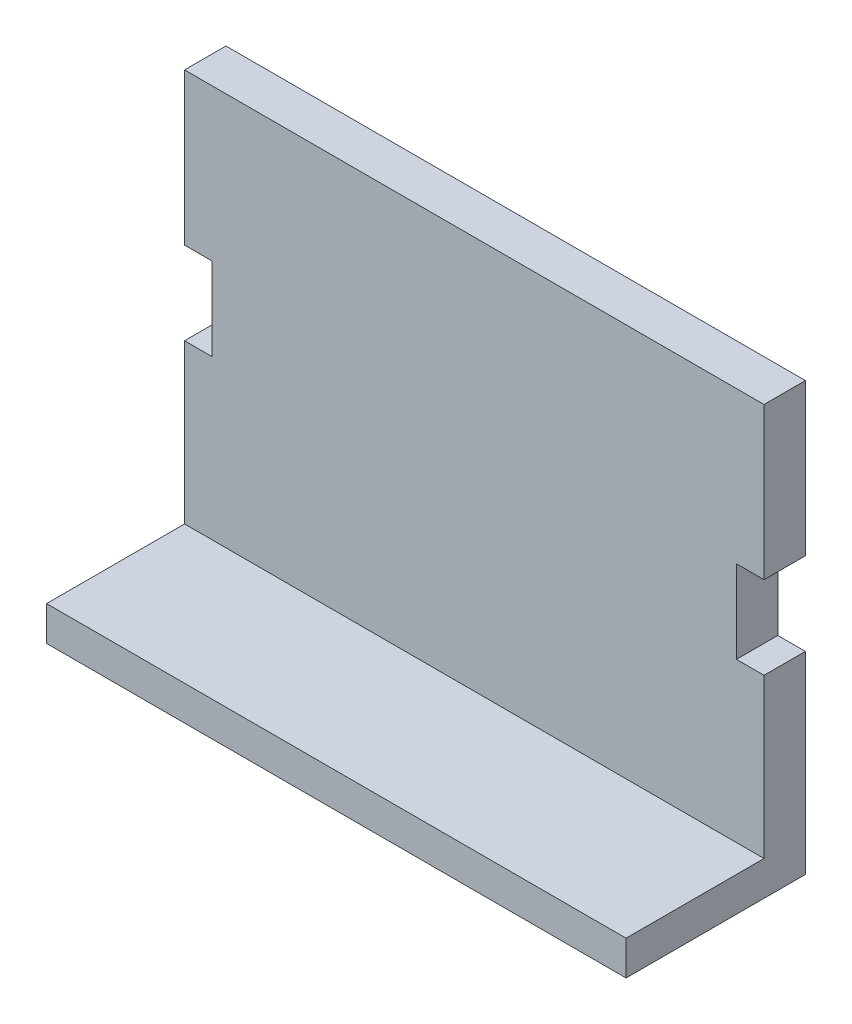
ISO-10303-21;
HEADER;
FILE_DESCRIPTION(('STEP AP214'),'2;1');
FILE_NAME('part.step','',(''),(''),'','','');
FILE_SCHEMA(('AUTOMOTIVE_DESIGN { 1 0 10303 214 1 1 1 1 }'));
ENDSEC;
DATA;
#1=APPLICATION_CONTEXT('core data for automotive mechanical design processes');
#2=APPLICATION_PROTOCOL_DEFINITION('international standard','automotive_design',2000,#1);
#3=PRODUCT_CONTEXT('',#1,'mechanical');
#4=PRODUCT('Part','Part','',(#3));
#5=PRODUCT_RELATED_PRODUCT_CATEGORY('part','',(#4));
#6=PRODUCT_DEFINITION_FORMATION('','',#4);
#7=PRODUCT_DEFINITION_CONTEXT('part definition',#1,'design');
#8=PRODUCT_DEFINITION('design','',#6,#7);
#9=PRODUCT_DEFINITION_SHAPE('','',#8);
#10=(LENGTH_UNIT() NAMED_UNIT(*) SI_UNIT(.MILLI.,.METRE.));
#11=(NAMED_UNIT(*) PLANE_ANGLE_UNIT() SI_UNIT($,.RADIAN.));
#12=(NAMED_UNIT(*) SI_UNIT($,.STERADIAN.) SOLID_ANGLE_UNIT());
#13=UNCERTAINTY_MEASURE_WITH_UNIT(LENGTH_MEASURE(1.E-05),#10,'distance_accuracy_value','');
#14=(GEOMETRIC_REPRESENTATION_CONTEXT(3) GLOBAL_UNCERTAINTY_ASSIGNED_CONTEXT((#13)) GLOBAL_UNIT_ASSIGNED_CONTEXT((#10,
#11,#12)) REPRESENTATION_CONTEXT('',''));
#15=CARTESIAN_POINT('',(0.,0.,0.));
#16=DIRECTION('',(0.,0.,1.));
#17=DIRECTION('',(1.,0.,0.));
#18=AXIS2_PLACEMENT_3D('',#15,#16,#17);
#19=CARTESIAN_POINT('',(0.,0.,6.));
#20=DIRECTION('',(0.,0.,-1.));
#21=DIRECTION('',(-1.,0.,0.));
#22=AXIS2_PLACEMENT_3D('',#19,#20,#21);
#23=PLANE('',#22);
#24=DIRECTION('',(-1.,0.,0.));
#25=VECTOR('',#24,1.);
#26=CARTESIAN_POINT('',(0.,5.,6.));
#27=LINE('',#26,#25);
#28=CARTESIAN_POINT('',(84.,5.,6.));
#29=VERTEX_POINT('',#28);
#30=CARTESIAN_POINT('',(0.,5.,6.));
#31=VERTEX_POINT('',#30);
#32=EDGE_CURVE('E59',#29,#31,#27,.T.);
#33=ORIENTED_EDGE('',*,*,#32,.F.);
#34=DIRECTION('',(0.,1.,0.));
#35=VECTOR('',#34,1.);
#36=CARTESIAN_POINT('',(84.,0.,6.));
#37=LINE('',#36,#35);
#38=CARTESIAN_POINT('',(84.,28.,6.));
#39=VERTEX_POINT('',#38);
#40=EDGE_CURVE('E116',#29,#39,#37,.T.);
#41=ORIENTED_EDGE('',*,*,#40,.T.);
#42=DIRECTION('',(-1.,0.,0.));
#43=VECTOR('',#42,1.);
#44=CARTESIAN_POINT('',(84.,28.,6.));
#45=LINE('',#44,#43);
#46=CARTESIAN_POINT('',(80.,28.,6.));
#47=VERTEX_POINT('',#46);
#48=EDGE_CURVE('E268',#39,#47,#45,.T.);
#49=ORIENTED_EDGE('',*,*,#48,.T.);
#50=DIRECTION('',(0.,1.,0.));
#51=VECTOR('',#50,1.);
#52=CARTESIAN_POINT('',(80.,28.,6.));
#53=LINE('',#52,#51);
#54=CARTESIAN_POINT('',(80.,40.,6.));
#55=VERTEX_POINT('',#54);
#56=EDGE_CURVE('E264',#47,#55,#53,.T.);
#57=ORIENTED_EDGE('',*,*,#56,.T.);
#58=DIRECTION('',(1.,0.,0.));
#59=VECTOR('',#58,1.);
#60=CARTESIAN_POINT('',(80.,40.,6.));
#61=LINE('',#60,#59);
#62=CARTESIAN_POINT('',(84.,40.,6.));
#63=VERTEX_POINT('',#62);
#64=EDGE_CURVE('E267',#55,#63,#61,.T.);
#65=ORIENTED_EDGE('',*,*,#64,.T.);
#66=DIRECTION('',(0.,1.,0.));
#67=VECTOR('',#66,1.);
#68=CARTESIAN_POINT('',(84.,62.,6.));
#69=LINE('',#68,#67);
#70=CARTESIAN_POINT('',(84.,62.,6.));
#71=VERTEX_POINT('',#70);
#72=EDGE_CURVE('E272',#63,#71,#69,.T.);
#73=ORIENTED_EDGE('',*,*,#72,.T.);
#74=DIRECTION('',(-1.,0.,0.));
#75=VECTOR('',#74,1.);
#76=CARTESIAN_POINT('',(0.,62.,6.));
#77=LINE('',#76,#75);
#78=CARTESIAN_POINT('',(0.,62.,6.));
#79=VERTEX_POINT('',#78);
#80=EDGE_CURVE('E279',#71,#79,#77,.T.);
#81=ORIENTED_EDGE('',*,*,#80,.T.);
#82=DIRECTION('',(0.,-1.,0.));
#83=VECTOR('',#82,1.);
#84=CARTESIAN_POINT('',(0.,40.,6.));
#85=LINE('',#84,#83);
#86=CARTESIAN_POINT('',(0.,40.,6.));
#87=VERTEX_POINT('',#86);
#88=EDGE_CURVE('E145',#79,#87,#85,.T.);
#89=ORIENTED_EDGE('',*,*,#88,.T.);
#90=DIRECTION('',(1.,0.,0.));
#91=VECTOR('',#90,1.);
#92=CARTESIAN_POINT('',(4.,40.,6.));
#93=LINE('',#92,#91);
#94=CARTESIAN_POINT('',(4.,40.,6.));
#95=VERTEX_POINT('',#94);
#96=EDGE_CURVE('E139',#87,#95,#93,.T.);
#97=ORIENTED_EDGE('',*,*,#96,.T.);
#98=DIRECTION('',(0.,-1.,0.));
#99=VECTOR('',#98,1.);
#100=CARTESIAN_POINT('',(4.,28.,6.));
#101=LINE('',#100,#99);
#102=CARTESIAN_POINT('',(4.,28.,6.));
#103=VERTEX_POINT('',#102);
#104=EDGE_CURVE('E142',#95,#103,#101,.T.);
#105=ORIENTED_EDGE('',*,*,#104,.T.);
#106=DIRECTION('',(-1.,0.,0.));
#107=VECTOR('',#106,1.);
#108=CARTESIAN_POINT('',(0.,28.,6.));
#109=LINE('',#108,#107);
#110=CARTESIAN_POINT('',(0.,28.,6.));
#111=VERTEX_POINT('',#110);
#112=EDGE_CURVE('E66',#103,#111,#109,.T.);
#113=ORIENTED_EDGE('',*,*,#112,.T.);
#114=DIRECTION('',(0.,-1.,0.));
#115=VECTOR('',#114,1.);
#116=CARTESIAN_POINT('',(0.,0.,6.));
#117=LINE('',#116,#115);
#118=EDGE_CURVE('E206',#111,#31,#117,.T.);
#119=ORIENTED_EDGE('',*,*,#118,.T.);
#120=EDGE_LOOP('',(#33,#41,#49,#57,#65,#73,#81,#89,#97,#105,#113,#119));
#121=FACE_BOUND('',#120,.T.);
#122=ADVANCED_FACE('F43',(#121),#23,.F.);
#123=CARTESIAN_POINT('',(0.,0.,6.));
#124=DIRECTION('',(1.,0.,0.));
#125=DIRECTION('',(0.,0.,-1.));
#126=AXIS2_PLACEMENT_3D('',#123,#124,#125);
#127=PLANE('',#126);
#128=DIRECTION('',(0.,-1.,0.));
#129=VECTOR('',#128,1.);
#130=CARTESIAN_POINT('',(0.,0.,0.));
#131=LINE('',#130,#129);
#132=CARTESIAN_POINT('',(0.,28.,0.));
#133=VERTEX_POINT('',#132);
#134=CARTESIAN_POINT('',(0.,0.,0.));
#135=VERTEX_POINT('',#134);
#136=EDGE_CURVE('E170',#133,#135,#131,.T.);
#137=ORIENTED_EDGE('',*,*,#136,.T.);
#138=DIRECTION('',(0.,0.,-1.));
#139=VECTOR('',#138,1.);
#140=CARTESIAN_POINT('',(0.,0.,6.));
#141=LINE('',#140,#139);
#142=CARTESIAN_POINT('',(0.,0.,26.));
#143=VERTEX_POINT('',#142);
#144=EDGE_CURVE('E11',#143,#135,#141,.T.);
#145=ORIENTED_EDGE('',*,*,#144,.F.);
#146=DIRECTION('',(0.,-1.,0.));
#147=VECTOR('',#146,1.);
#148=CARTESIAN_POINT('',(0.,0.,26.));
#149=LINE('',#148,#147);
#150=CARTESIAN_POINT('',(0.,5.,26.));
#151=VERTEX_POINT('',#150);
#152=EDGE_CURVE('E308',#151,#143,#149,.T.);
#153=ORIENTED_EDGE('',*,*,#152,.F.);
#154=DIRECTION('',(0.,0.,-1.));
#155=VECTOR('',#154,1.);
#156=CARTESIAN_POINT('',(0.,5.,26.));
#157=LINE('',#156,#155);
#158=EDGE_CURVE('E298',#151,#31,#157,.T.);
#159=ORIENTED_EDGE('',*,*,#158,.T.);
#160=ORIENTED_EDGE('',*,*,#118,.F.);
#161=DIRECTION('',(0.,0.,-1.));
#162=VECTOR('',#161,1.);
#163=CARTESIAN_POINT('',(0.,28.,6.));
#164=LINE('',#163,#162);
#165=EDGE_CURVE('E166',#111,#133,#164,.T.);
#166=ORIENTED_EDGE('',*,*,#165,.T.);
#167=EDGE_LOOP('',(#137,#145,#153,#159,#160,#166));
#168=FACE_BOUND('',#167,.T.);
#169=ADVANCED_FACE('F45',(#168),#127,.F.);
#170=CARTESIAN_POINT('',(0.,0.,6.));
#171=DIRECTION('',(0.,1.,0.));
#172=DIRECTION('',(0.,0.,1.));
#173=AXIS2_PLACEMENT_3D('',#170,#171,#172);
#174=PLANE('',#173);
#175=DIRECTION('',(1.,0.,0.));
#176=VECTOR('',#175,1.);
#177=CARTESIAN_POINT('',(0.,0.,0.));
#178=LINE('',#177,#176);
#179=CARTESIAN_POINT('',(84.,0.,0.));
#180=VERTEX_POINT('',#179);
#181=EDGE_CURVE('E174',#135,#180,#178,.T.);
#182=ORIENTED_EDGE('',*,*,#181,.T.);
#183=DIRECTION('',(0.,0.,-1.));
#184=VECTOR('',#183,1.);
#185=CARTESIAN_POINT('',(84.,0.,6.));
#186=LINE('',#185,#184);
#187=CARTESIAN_POINT('',(84.,0.,26.));
#188=VERTEX_POINT('',#187);
#189=EDGE_CURVE('E52',#188,#180,#186,.T.);
#190=ORIENTED_EDGE('',*,*,#189,.F.);
#191=DIRECTION('',(1.,0.,0.));
#192=VECTOR('',#191,1.);
#193=CARTESIAN_POINT('',(84.,0.,26.));
#194=LINE('',#193,#192);
#195=EDGE_CURVE('E311',#143,#188,#194,.T.);
#196=ORIENTED_EDGE('',*,*,#195,.F.);
#197=ORIENTED_EDGE('',*,*,#144,.T.);
#198=EDGE_LOOP('',(#182,#190,#196,#197));
#199=FACE_BOUND('',#198,.T.);
#200=ADVANCED_FACE('F326',(#199),#174,.F.);
#201=CARTESIAN_POINT('',(84.,0.,6.));
#202=DIRECTION('',(-1.,0.,0.));
#203=DIRECTION('',(0.,0.,1.));
#204=AXIS2_PLACEMENT_3D('',#201,#202,#203);
#205=PLANE('',#204);
#206=DIRECTION('',(0.,1.,0.));
#207=VECTOR('',#206,1.);
#208=CARTESIAN_POINT('',(84.,0.,0.));
#209=LINE('',#208,#207);
#210=CARTESIAN_POINT('',(84.,28.,0.));
#211=VERTEX_POINT('',#210);
#212=EDGE_CURVE('E178',#180,#211,#209,.T.);
#213=ORIENTED_EDGE('',*,*,#212,.T.);
#214=DIRECTION('',(0.,0.,-1.));
#215=VECTOR('',#214,1.);
#216=CARTESIAN_POINT('',(84.,28.,6.));
#217=LINE('',#216,#215);
#218=EDGE_CURVE('E233',#39,#211,#217,.T.);
#219=ORIENTED_EDGE('',*,*,#218,.F.);
#220=ORIENTED_EDGE('',*,*,#40,.F.);
#221=DIRECTION('',(0.,0.,-1.));
#222=VECTOR('',#221,1.);
#223=CARTESIAN_POINT('',(84.,5.,26.));
#224=LINE('',#223,#222);
#225=CARTESIAN_POINT('',(84.,5.,26.));
#226=VERTEX_POINT('',#225);
#227=EDGE_CURVE('E175',#226,#29,#224,.T.);
#228=ORIENTED_EDGE('',*,*,#227,.F.);
#229=DIRECTION('',(0.,1.,0.));
#230=VECTOR('',#229,1.);
#231=CARTESIAN_POINT('',(84.,5.,26.));
#232=LINE('',#231,#230);
#233=EDGE_CURVE('E246',#188,#226,#232,.T.);
#234=ORIENTED_EDGE('',*,*,#233,.F.);
#235=ORIENTED_EDGE('',*,*,#189,.T.);
#236=EDGE_LOOP('',(#213,#219,#220,#228,#234,#235));
#237=FACE_BOUND('',#236,.T.);
#238=ADVANCED_FACE('F242',(#237),#205,.F.);
#239=CARTESIAN_POINT('',(84.,28.,6.));
#240=DIRECTION('',(0.,-1.,0.));
#241=DIRECTION('',(0.,0.,-1.));
#242=AXIS2_PLACEMENT_3D('',#239,#240,#241);
#243=PLANE('',#242);
#244=DIRECTION('',(-1.,0.,0.));
#245=VECTOR('',#244,1.);
#246=CARTESIAN_POINT('',(84.,28.,0.));
#247=LINE('',#246,#245);
#248=CARTESIAN_POINT('',(80.,28.,0.));
#249=VERTEX_POINT('',#248);
#250=EDGE_CURVE('E181',#211,#249,#247,.T.);
#251=ORIENTED_EDGE('',*,*,#250,.T.);
#252=DIRECTION('',(0.,0.,-1.));
#253=VECTOR('',#252,1.);
#254=CARTESIAN_POINT('',(80.,28.,6.));
#255=LINE('',#254,#253);
#256=EDGE_CURVE('E229',#47,#249,#255,.T.);
#257=ORIENTED_EDGE('',*,*,#256,.F.);
#258=ORIENTED_EDGE('',*,*,#48,.F.);
#259=ORIENTED_EDGE('',*,*,#218,.T.);
#260=EDGE_LOOP('',(#251,#257,#258,#259));
#261=FACE_BOUND('',#260,.T.);
#262=ADVANCED_FACE('F258',(#261),#243,.F.);
#263=CARTESIAN_POINT('',(80.,28.,6.));
#264=DIRECTION('',(-1.,0.,0.));
#265=DIRECTION('',(0.,0.,1.));
#266=AXIS2_PLACEMENT_3D('',#263,#264,#265);
#267=PLANE('',#266);
#268=DIRECTION('',(0.,1.,0.));
#269=VECTOR('',#268,1.);
#270=CARTESIAN_POINT('',(80.,28.,0.));
#271=LINE('',#270,#269);
#272=CARTESIAN_POINT('',(80.,40.,0.));
#273=VERTEX_POINT('',#272);
#274=EDGE_CURVE('E184',#249,#273,#271,.T.);
#275=ORIENTED_EDGE('',*,*,#274,.T.);
#276=DIRECTION('',(0.,0.,-1.));
#277=VECTOR('',#276,1.);
#278=CARTESIAN_POINT('',(80.,40.,6.));
#279=LINE('',#278,#277);
#280=EDGE_CURVE('E225',#55,#273,#279,.T.);
#281=ORIENTED_EDGE('',*,*,#280,.F.);
#282=ORIENTED_EDGE('',*,*,#56,.F.);
#283=ORIENTED_EDGE('',*,*,#256,.T.);
#284=EDGE_LOOP('',(#275,#281,#282,#283));
#285=FACE_BOUND('',#284,.T.);
#286=ADVANCED_FACE('F262',(#285),#267,.F.);
#287=CARTESIAN_POINT('',(80.,40.,6.));
#288=DIRECTION('',(0.,1.,0.));
#289=DIRECTION('',(0.,0.,1.));
#290=AXIS2_PLACEMENT_3D('',#287,#288,#289);
#291=PLANE('',#290);
#292=DIRECTION('',(1.,0.,0.));
#293=VECTOR('',#292,1.);
#294=CARTESIAN_POINT('',(80.,40.,0.));
#295=LINE('',#294,#293);
#296=CARTESIAN_POINT('',(84.,40.,0.));
#297=VERTEX_POINT('',#296);
#298=EDGE_CURVE('E187',#273,#297,#295,.T.);
#299=ORIENTED_EDGE('',*,*,#298,.T.);
#300=DIRECTION('',(0.,0.,-1.));
#301=VECTOR('',#300,1.);
#302=CARTESIAN_POINT('',(84.,40.,6.));
#303=LINE('',#302,#301);
#304=EDGE_CURVE('E221',#63,#297,#303,.T.);
#305=ORIENTED_EDGE('',*,*,#304,.F.);
#306=ORIENTED_EDGE('',*,*,#64,.F.);
#307=ORIENTED_EDGE('',*,*,#280,.T.);
#308=EDGE_LOOP('',(#299,#305,#306,#307));
#309=FACE_BOUND('',#308,.T.);
#310=ADVANCED_FACE('F361',(#309),#291,.F.);
#311=CARTESIAN_POINT('',(84.,62.,6.));
#312=DIRECTION('',(-1.,0.,0.));
#313=DIRECTION('',(0.,0.,1.));
#314=AXIS2_PLACEMENT_3D('',#311,#312,#313);
#315=PLANE('',#314);
#316=DIRECTION('',(0.,1.,0.));
#317=VECTOR('',#316,1.);
#318=CARTESIAN_POINT('',(84.,62.,0.));
#319=LINE('',#318,#317);
#320=CARTESIAN_POINT('',(84.,62.,0.));
#321=VERTEX_POINT('',#320);
#322=EDGE_CURVE('E190',#297,#321,#319,.T.);
#323=ORIENTED_EDGE('',*,*,#322,.T.);
#324=DIRECTION('',(0.,0.,-1.));
#325=VECTOR('',#324,1.);
#326=CARTESIAN_POINT('',(84.,62.,6.));
#327=LINE('',#326,#325);
#328=EDGE_CURVE('E217',#71,#321,#327,.T.);
#329=ORIENTED_EDGE('',*,*,#328,.F.);
#330=ORIENTED_EDGE('',*,*,#72,.F.);
#331=ORIENTED_EDGE('',*,*,#304,.T.);
#332=EDGE_LOOP('',(#323,#329,#330,#331));
#333=FACE_BOUND('',#332,.T.);
#334=ADVANCED_FACE('F358',(#333),#315,.F.);
#335=CARTESIAN_POINT('',(0.,62.,6.));
#336=DIRECTION('',(0.,-1.,0.));
#337=DIRECTION('',(0.,0.,-1.));
#338=AXIS2_PLACEMENT_3D('',#335,#336,#337);
#339=PLANE('',#338);
#340=DIRECTION('',(-1.,0.,0.));
#341=VECTOR('',#340,1.);
#342=CARTESIAN_POINT('',(0.,62.,0.));
#343=LINE('',#342,#341);
#344=CARTESIAN_POINT('',(0.,62.,0.));
#345=VERTEX_POINT('',#344);
#346=EDGE_CURVE('E193',#321,#345,#343,.T.);
#347=ORIENTED_EDGE('',*,*,#346,.T.);
#348=DIRECTION('',(0.,0.,-1.));
#349=VECTOR('',#348,1.);
#350=CARTESIAN_POINT('',(0.,62.,6.));
#351=LINE('',#350,#349);
#352=EDGE_CURVE('E213',#79,#345,#351,.T.);
#353=ORIENTED_EDGE('',*,*,#352,.F.);
#354=ORIENTED_EDGE('',*,*,#80,.F.);
#355=ORIENTED_EDGE('',*,*,#328,.T.);
#356=EDGE_LOOP('',(#347,#353,#354,#355));
#357=FACE_BOUND('',#356,.T.);
#358=ADVANCED_FACE('F287',(#357),#339,.F.);
#359=CARTESIAN_POINT('',(0.,40.,6.));
#360=DIRECTION('',(1.,0.,0.));
#361=DIRECTION('',(0.,0.,-1.));
#362=AXIS2_PLACEMENT_3D('',#359,#360,#361);
#363=PLANE('',#362);
#364=DIRECTION('',(0.,-1.,0.));
#365=VECTOR('',#364,1.);
#366=CARTESIAN_POINT('',(0.,40.,0.));
#367=LINE('',#366,#365);
#368=CARTESIAN_POINT('',(0.,40.,0.));
#369=VERTEX_POINT('',#368);
#370=EDGE_CURVE('E196',#345,#369,#367,.T.);
#371=ORIENTED_EDGE('',*,*,#370,.T.);
#372=DIRECTION('',(0.,0.,-1.));
#373=VECTOR('',#372,1.);
#374=CARTESIAN_POINT('',(0.,40.,6.));
#375=LINE('',#374,#373);
#376=EDGE_CURVE('E159',#87,#369,#375,.T.);
#377=ORIENTED_EDGE('',*,*,#376,.F.);
#378=ORIENTED_EDGE('',*,*,#88,.F.);
#379=ORIENTED_EDGE('',*,*,#352,.T.);
#380=EDGE_LOOP('',(#371,#377,#378,#379));
#381=FACE_BOUND('',#380,.T.);
#382=ADVANCED_FACE('F291',(#381),#363,.F.);
#383=CARTESIAN_POINT('',(4.,40.,6.));
#384=DIRECTION('',(0.,1.,0.));
#385=DIRECTION('',(0.,0.,1.));
#386=AXIS2_PLACEMENT_3D('',#383,#384,#385);
#387=PLANE('',#386);
#388=DIRECTION('',(1.,0.,0.));
#389=VECTOR('',#388,1.);
#390=CARTESIAN_POINT('',(4.,40.,0.));
#391=LINE('',#390,#389);
#392=CARTESIAN_POINT('',(4.,40.,0.));
#393=VERTEX_POINT('',#392);
#394=EDGE_CURVE('E155',#369,#393,#391,.T.);
#395=ORIENTED_EDGE('',*,*,#394,.T.);
#396=DIRECTION('',(0.,0.,-1.));
#397=VECTOR('',#396,1.);
#398=CARTESIAN_POINT('',(4.,40.,6.));
#399=LINE('',#398,#397);
#400=EDGE_CURVE('E152',#95,#393,#399,.T.);
#401=ORIENTED_EDGE('',*,*,#400,.F.);
#402=ORIENTED_EDGE('',*,*,#96,.F.);
#403=ORIENTED_EDGE('',*,*,#376,.T.);
#404=EDGE_LOOP('',(#395,#401,#402,#403));
#405=FACE_BOUND('',#404,.T.);
#406=ADVANCED_FACE('F153',(#405),#387,.F.);
#407=CARTESIAN_POINT('',(4.,28.,6.));
#408=DIRECTION('',(1.,0.,0.));
#409=DIRECTION('',(0.,0.,-1.));
#410=AXIS2_PLACEMENT_3D('',#407,#408,#409);
#411=PLANE('',#410);
#412=DIRECTION('',(0.,-1.,0.));
#413=VECTOR('',#412,1.);
#414=CARTESIAN_POINT('',(4.,28.,0.));
#415=LINE('',#414,#413);
#416=CARTESIAN_POINT('',(4.,28.,0.));
#417=VERTEX_POINT('',#416);
#418=EDGE_CURVE('E201',#393,#417,#415,.T.);
#419=ORIENTED_EDGE('',*,*,#418,.T.);
#420=DIRECTION('',(0.,0.,-1.));
#421=VECTOR('',#420,1.);
#422=CARTESIAN_POINT('',(4.,28.,6.));
#423=LINE('',#422,#421);
#424=EDGE_CURVE('E160',#103,#417,#423,.T.);
#425=ORIENTED_EDGE('',*,*,#424,.F.);
#426=ORIENTED_EDGE('',*,*,#104,.F.);
#427=ORIENTED_EDGE('',*,*,#400,.T.);
#428=EDGE_LOOP('',(#419,#425,#426,#427));
#429=FACE_BOUND('',#428,.T.);
#430=ADVANCED_FACE('F162',(#429),#411,.F.);
#431=CARTESIAN_POINT('',(0.,28.,6.));
#432=DIRECTION('',(0.,-1.,0.));
#433=DIRECTION('',(0.,0.,-1.));
#434=AXIS2_PLACEMENT_3D('',#431,#432,#433);
#435=PLANE('',#434);
#436=DIRECTION('',(-1.,0.,0.));
#437=VECTOR('',#436,1.);
#438=CARTESIAN_POINT('',(0.,28.,0.));
#439=LINE('',#438,#437);
#440=EDGE_CURVE('E111',#417,#133,#439,.T.);
#441=ORIENTED_EDGE('',*,*,#440,.T.);
#442=ORIENTED_EDGE('',*,*,#165,.F.);
#443=ORIENTED_EDGE('',*,*,#112,.F.);
#444=ORIENTED_EDGE('',*,*,#424,.T.);
#445=EDGE_LOOP('',(#441,#442,#443,#444));
#446=FACE_BOUND('',#445,.T.);
#447=ADVANCED_FACE('F292',(#446),#435,.F.);
#448=CARTESIAN_POINT('',(0.,0.,0.));
#449=DIRECTION('',(0.,0.,-1.));
#450=DIRECTION('',(-1.,0.,0.));
#451=AXIS2_PLACEMENT_3D('',#448,#449,#450);
#452=PLANE('',#451);
#453=ORIENTED_EDGE('',*,*,#136,.F.);
#454=ORIENTED_EDGE('',*,*,#440,.F.);
#455=ORIENTED_EDGE('',*,*,#418,.F.);
#456=ORIENTED_EDGE('',*,*,#394,.F.);
#457=ORIENTED_EDGE('',*,*,#370,.F.);
#458=ORIENTED_EDGE('',*,*,#346,.F.);
#459=ORIENTED_EDGE('',*,*,#322,.F.);
#460=ORIENTED_EDGE('',*,*,#298,.F.);
#461=ORIENTED_EDGE('',*,*,#274,.F.);
#462=ORIENTED_EDGE('',*,*,#250,.F.);
#463=ORIENTED_EDGE('',*,*,#212,.F.);
#464=ORIENTED_EDGE('',*,*,#181,.F.);
#465=EDGE_LOOP('',(#453,#454,#455,#456,#457,#458,#459,#460,#461,#462,#463,#464));
#466=FACE_BOUND('',#465,.T.);
#467=ADVANCED_FACE('F253',(#466),#452,.T.);
#468=CARTESIAN_POINT('',(0.,5.,26.));
#469=DIRECTION('',(0.,-1.,0.));
#470=DIRECTION('',(0.,0.,-1.));
#471=AXIS2_PLACEMENT_3D('',#468,#469,#470);
#472=PLANE('',#471);
#473=ORIENTED_EDGE('',*,*,#32,.T.);
#474=ORIENTED_EDGE('',*,*,#158,.F.);
#475=DIRECTION('',(-1.,0.,0.));
#476=VECTOR('',#475,1.);
#477=CARTESIAN_POINT('',(0.,5.,26.));
#478=LINE('',#477,#476);
#479=EDGE_CURVE('E315',#226,#151,#478,.T.);
#480=ORIENTED_EDGE('',*,*,#479,.F.);
#481=ORIENTED_EDGE('',*,*,#227,.T.);
#482=EDGE_LOOP('',(#473,#474,#480,#481));
#483=FACE_BOUND('',#482,.T.);
#484=ADVANCED_FACE('F333',(#483),#472,.F.);
#485=CARTESIAN_POINT('',(0.,0.,26.));
#486=DIRECTION('',(0.,0.,-1.));
#487=DIRECTION('',(-1.,0.,0.));
#488=AXIS2_PLACEMENT_3D('',#485,#486,#487);
#489=PLANE('',#488);
#490=ORIENTED_EDGE('',*,*,#195,.T.);
#491=ORIENTED_EDGE('',*,*,#233,.T.);
#492=ORIENTED_EDGE('',*,*,#479,.T.);
#493=ORIENTED_EDGE('',*,*,#152,.T.);
#494=EDGE_LOOP('',(#490,#491,#492,#493));
#495=FACE_BOUND('',#494,.T.);
#496=ADVANCED_FACE('F323',(#495),#489,.F.);
#497=CLOSED_SHELL('',(#122,#169,#200,#238,#262,#286,#310,#334,#358,#382,#406,#430,#447,#467,
#484,#496));
#498=MANIFOLD_SOLID_BREP('B2',#497);
#499=ADVANCED_BREP_SHAPE_REPRESENTATION('',(#18,#498),#14);
#500=SHAPE_DEFINITION_REPRESENTATION(#9,#499);
ENDSEC;
END-ISO-10303-21;
